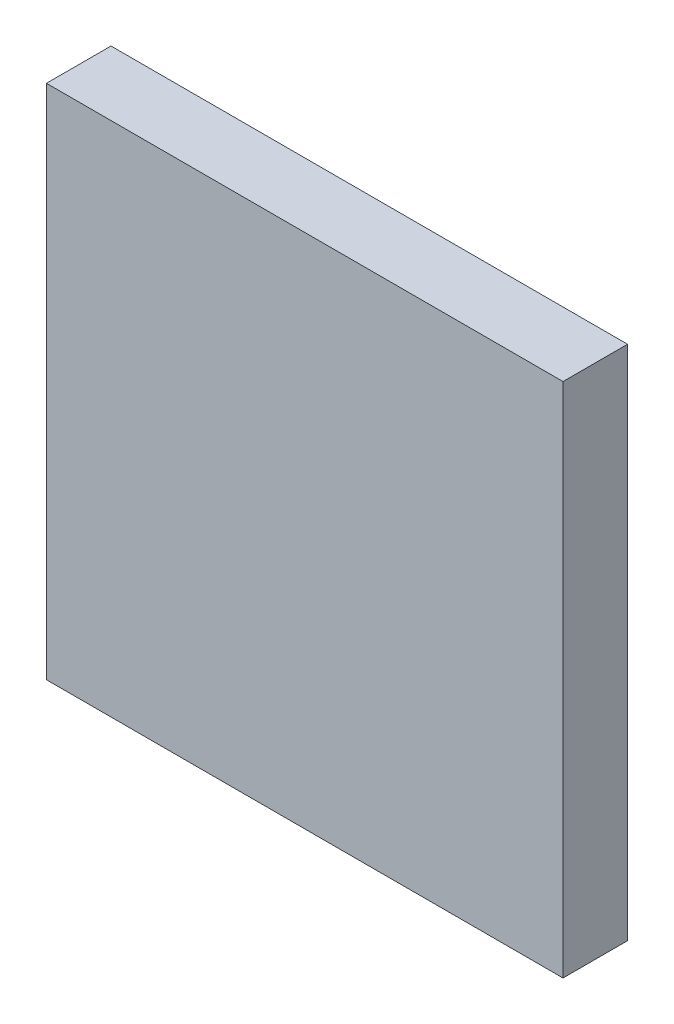
ISO-10303-21;
HEADER;
FILE_DESCRIPTION(('STEP AP214'),'2;1');
FILE_NAME('part.step','',(''),(''),'','','');
FILE_SCHEMA(('AUTOMOTIVE_DESIGN { 1 0 10303 214 1 1 1 1 }'));
ENDSEC;
DATA;
#1=APPLICATION_CONTEXT('core data for automotive mechanical design processes');
#2=APPLICATION_PROTOCOL_DEFINITION('international standard','automotive_design',2000,#1);
#3=PRODUCT_CONTEXT('',#1,'mechanical');
#4=PRODUCT('Part','Part','',(#3));
#5=PRODUCT_RELATED_PRODUCT_CATEGORY('part','',(#4));
#6=PRODUCT_DEFINITION_FORMATION('','',#4);
#7=PRODUCT_DEFINITION_CONTEXT('part definition',#1,'design');
#8=PRODUCT_DEFINITION('design','',#6,#7);
#9=PRODUCT_DEFINITION_SHAPE('','',#8);
#10=(LENGTH_UNIT() NAMED_UNIT(*) SI_UNIT(.MILLI.,.METRE.));
#11=(NAMED_UNIT(*) PLANE_ANGLE_UNIT() SI_UNIT($,.RADIAN.));
#12=(NAMED_UNIT(*) SI_UNIT($,.STERADIAN.) SOLID_ANGLE_UNIT());
#13=UNCERTAINTY_MEASURE_WITH_UNIT(LENGTH_MEASURE(1.E-05),#10,'distance_accuracy_value','');
#14=(GEOMETRIC_REPRESENTATION_CONTEXT(3) GLOBAL_UNCERTAINTY_ASSIGNED_CONTEXT((#13)) GLOBAL_UNIT_ASSIGNED_CONTEXT((#10,
#11,#12)) REPRESENTATION_CONTEXT('',''));
#15=CARTESIAN_POINT('',(0.,0.,0.));
#16=DIRECTION('',(0.,0.,1.));
#17=DIRECTION('',(1.,0.,0.));
#18=AXIS2_PLACEMENT_3D('',#15,#16,#17);
#19=CARTESIAN_POINT('',(-200.,200.,50.));
#20=DIRECTION('',(0.,-1.,0.));
#21=DIRECTION('',(0.,0.,-1.));
#22=AXIS2_PLACEMENT_3D('',#19,#20,#21);
#23=PLANE('',#22);
#24=DIRECTION('',(-1.,0.,0.));
#25=VECTOR('',#24,1.);
#26=CARTESIAN_POINT('',(-200.,200.,0.));
#27=LINE('',#26,#25);
#28=CARTESIAN_POINT('',(200.,200.,0.));
#29=VERTEX_POINT('',#28);
#30=CARTESIAN_POINT('',(-200.,200.,0.));
#31=VERTEX_POINT('',#30);
#32=EDGE_CURVE('E102',#29,#31,#27,.T.);
#33=ORIENTED_EDGE('',*,*,#32,.T.);
#34=DIRECTION('',(0.,0.,-1.));
#35=VECTOR('',#34,1.);
#36=CARTESIAN_POINT('',(-200.,200.,50.));
#37=LINE('',#36,#35);
#38=CARTESIAN_POINT('',(-200.,200.,50.));
#39=VERTEX_POINT('',#38);
#40=EDGE_CURVE('E11',#39,#31,#37,.T.);
#41=ORIENTED_EDGE('',*,*,#40,.F.);
#42=DIRECTION('',(-1.,0.,0.));
#43=VECTOR('',#42,1.);
#44=CARTESIAN_POINT('',(-200.,200.,50.));
#45=LINE('',#44,#43);
#46=CARTESIAN_POINT('',(200.,200.,50.));
#47=VERTEX_POINT('',#46);
#48=EDGE_CURVE('E90',#47,#39,#45,.T.);
#49=ORIENTED_EDGE('',*,*,#48,.F.);
#50=DIRECTION('',(0.,0.,-1.));
#51=VECTOR('',#50,1.);
#52=CARTESIAN_POINT('',(200.,200.,50.));
#53=LINE('',#52,#51);
#54=EDGE_CURVE('E98',#47,#29,#53,.T.);
#55=ORIENTED_EDGE('',*,*,#54,.T.);
#56=EDGE_LOOP('',(#33,#41,#49,#55));
#57=FACE_BOUND('',#56,.T.);
#58=ADVANCED_FACE('F39',(#57),#23,.F.);
#59=CARTESIAN_POINT('',(-200.,-200.,50.));
#60=DIRECTION('',(1.,0.,0.));
#61=DIRECTION('',(0.,0.,-1.));
#62=AXIS2_PLACEMENT_3D('',#59,#60,#61);
#63=PLANE('',#62);
#64=DIRECTION('',(0.,-1.,0.));
#65=VECTOR('',#64,1.);
#66=CARTESIAN_POINT('',(-200.,-200.,0.));
#67=LINE('',#66,#65);
#68=CARTESIAN_POINT('',(-200.,-200.,0.));
#69=VERTEX_POINT('',#68);
#70=EDGE_CURVE('E94',#31,#69,#67,.T.);
#71=ORIENTED_EDGE('',*,*,#70,.T.);
#72=DIRECTION('',(0.,0.,-1.));
#73=VECTOR('',#72,1.);
#74=CARTESIAN_POINT('',(-200.,-200.,50.));
#75=LINE('',#74,#73);
#76=CARTESIAN_POINT('',(-200.,-200.,50.));
#77=VERTEX_POINT('',#76);
#78=EDGE_CURVE('E47',#77,#69,#75,.T.);
#79=ORIENTED_EDGE('',*,*,#78,.F.);
#80=DIRECTION('',(0.,-1.,0.));
#81=VECTOR('',#80,1.);
#82=CARTESIAN_POINT('',(-200.,-200.,50.));
#83=LINE('',#82,#81);
#84=EDGE_CURVE('E85',#39,#77,#83,.T.);
#85=ORIENTED_EDGE('',*,*,#84,.F.);
#86=ORIENTED_EDGE('',*,*,#40,.T.);
#87=EDGE_LOOP('',(#71,#79,#85,#86));
#88=FACE_BOUND('',#87,.T.);
#89=ADVANCED_FACE('F93',(#88),#63,.F.);
#90=CARTESIAN_POINT('',(-200.,-200.,50.));
#91=DIRECTION('',(0.,1.,0.));
#92=DIRECTION('',(0.,0.,1.));
#93=AXIS2_PLACEMENT_3D('',#90,#91,#92);
#94=PLANE('',#93);
#95=DIRECTION('',(1.,0.,0.));
#96=VECTOR('',#95,1.);
#97=CARTESIAN_POINT('',(-200.,-200.,0.));
#98=LINE('',#97,#96);
#99=CARTESIAN_POINT('',(200.,-200.,0.));
#100=VERTEX_POINT('',#99);
#101=EDGE_CURVE('E72',#69,#100,#98,.T.);
#102=ORIENTED_EDGE('',*,*,#101,.T.);
#103=DIRECTION('',(0.,0.,-1.));
#104=VECTOR('',#103,1.);
#105=CARTESIAN_POINT('',(200.,-200.,50.));
#106=LINE('',#105,#104);
#107=CARTESIAN_POINT('',(200.,-200.,50.));
#108=VERTEX_POINT('',#107);
#109=EDGE_CURVE('E95',#108,#100,#106,.T.);
#110=ORIENTED_EDGE('',*,*,#109,.F.);
#111=DIRECTION('',(1.,0.,0.));
#112=VECTOR('',#111,1.);
#113=CARTESIAN_POINT('',(-200.,-200.,50.));
#114=LINE('',#113,#112);
#115=EDGE_CURVE('E88',#77,#108,#114,.T.);
#116=ORIENTED_EDGE('',*,*,#115,.F.);
#117=ORIENTED_EDGE('',*,*,#78,.T.);
#118=EDGE_LOOP('',(#102,#110,#116,#117));
#119=FACE_BOUND('',#118,.T.);
#120=ADVANCED_FACE('F96',(#119),#94,.F.);
#121=CARTESIAN_POINT('',(200.,-200.,50.));
#122=DIRECTION('',(-1.,0.,0.));
#123=DIRECTION('',(0.,0.,1.));
#124=AXIS2_PLACEMENT_3D('',#121,#122,#123);
#125=PLANE('',#124);
#126=DIRECTION('',(0.,1.,0.));
#127=VECTOR('',#126,1.);
#128=CARTESIAN_POINT('',(200.,-200.,0.));
#129=LINE('',#128,#127);
#130=EDGE_CURVE('E78',#100,#29,#129,.T.);
#131=ORIENTED_EDGE('',*,*,#130,.T.);
#132=ORIENTED_EDGE('',*,*,#54,.F.);
#133=DIRECTION('',(0.,1.,0.));
#134=VECTOR('',#133,1.);
#135=CARTESIAN_POINT('',(200.,-200.,50.));
#136=LINE('',#135,#134);
#137=EDGE_CURVE('E55',#108,#47,#136,.T.);
#138=ORIENTED_EDGE('',*,*,#137,.F.);
#139=ORIENTED_EDGE('',*,*,#109,.T.);
#140=EDGE_LOOP('',(#131,#132,#138,#139));
#141=FACE_BOUND('',#140,.T.);
#142=ADVANCED_FACE('F109',(#141),#125,.F.);
#143=CARTESIAN_POINT('',(0.,0.,50.));
#144=DIRECTION('',(0.,0.,1.));
#145=DIRECTION('',(1.,0.,0.));
#146=AXIS2_PLACEMENT_3D('',#143,#144,#145);
#147=PLANE('',#146);
#148=ORIENTED_EDGE('',*,*,#48,.T.);
#149=ORIENTED_EDGE('',*,*,#84,.T.);
#150=ORIENTED_EDGE('',*,*,#115,.T.);
#151=ORIENTED_EDGE('',*,*,#137,.T.);
#152=EDGE_LOOP('',(#148,#149,#150,#151));
#153=FACE_BOUND('',#152,.T.);
#154=ADVANCED_FACE('F86',(#153),#147,.T.);
#155=CARTESIAN_POINT('',(0.,0.,0.));
#156=DIRECTION('',(0.,0.,1.));
#157=DIRECTION('',(1.,0.,0.));
#158=AXIS2_PLACEMENT_3D('',#155,#156,#157);
#159=PLANE('',#158);
#160=ORIENTED_EDGE('',*,*,#32,.F.);
#161=ORIENTED_EDGE('',*,*,#130,.F.);
#162=ORIENTED_EDGE('',*,*,#101,.F.);
#163=ORIENTED_EDGE('',*,*,#70,.F.);
#164=EDGE_LOOP('',(#160,#161,#162,#163));
#165=FACE_BOUND('',#164,.T.);
#166=ADVANCED_FACE('F112',(#165),#159,.F.);
#167=CLOSED_SHELL('',(#58,#89,#120,#142,#154,#166));
#168=MANIFOLD_SOLID_BREP('B2',#167);
#169=ADVANCED_BREP_SHAPE_REPRESENTATION('',(#18,#168),#14);
#170=SHAPE_DEFINITION_REPRESENTATION(#9,#169);
ENDSEC;
END-ISO-10303-21;
